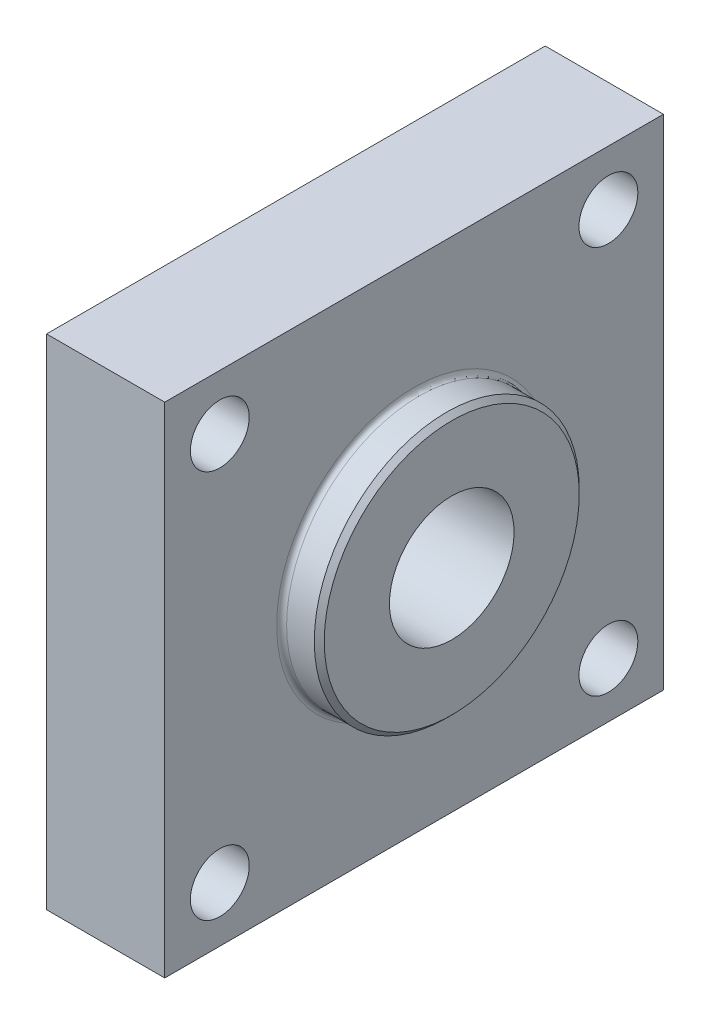
ISO-10303-21;
HEADER;
FILE_DESCRIPTION(('STEP AP214'),'2;1');
FILE_NAME('part.step','',(''),(''),'','','');
FILE_SCHEMA(('AUTOMOTIVE_DESIGN { 1 0 10303 214 1 1 1 1 }'));
ENDSEC;
DATA;
#1=APPLICATION_CONTEXT('core data for automotive mechanical design processes');
#2=APPLICATION_PROTOCOL_DEFINITION('international standard','automotive_design',2000,#1);
#3=PRODUCT_CONTEXT('',#1,'mechanical');
#4=PRODUCT('Part','Part','',(#3));
#5=PRODUCT_RELATED_PRODUCT_CATEGORY('part','',(#4));
#6=PRODUCT_DEFINITION_FORMATION('','',#4);
#7=PRODUCT_DEFINITION_CONTEXT('part definition',#1,'design');
#8=PRODUCT_DEFINITION('design','',#6,#7);
#9=PRODUCT_DEFINITION_SHAPE('','',#8);
#10=(LENGTH_UNIT() NAMED_UNIT(*) SI_UNIT(.MILLI.,.METRE.));
#11=(NAMED_UNIT(*) PLANE_ANGLE_UNIT() SI_UNIT($,.RADIAN.));
#12=(NAMED_UNIT(*) SI_UNIT($,.STERADIAN.) SOLID_ANGLE_UNIT());
#13=UNCERTAINTY_MEASURE_WITH_UNIT(LENGTH_MEASURE(1.E-05),#10,'distance_accuracy_value','');
#14=(GEOMETRIC_REPRESENTATION_CONTEXT(3) GLOBAL_UNCERTAINTY_ASSIGNED_CONTEXT((#13)) GLOBAL_UNIT_ASSIGNED_CONTEXT((#10,
#11,#12)) REPRESENTATION_CONTEXT('',''));
#15=CARTESIAN_POINT('',(0.,0.,0.));
#16=DIRECTION('',(0.,0.,1.));
#17=DIRECTION('',(1.,0.,0.));
#18=AXIS2_PLACEMENT_3D('',#15,#16,#17);
#19=CARTESIAN_POINT('',(3.96875,12.7,12.7));
#20=DIRECTION('',(0.,0.,-1.));
#21=DIRECTION('',(-1.,0.,0.));
#22=AXIS2_PLACEMENT_3D('',#19,#20,#21);
#23=PLANE('',#22);
#24=DIRECTION('',(0.,-1.,0.));
#25=VECTOR('',#24,1.);
#26=CARTESIAN_POINT('',(2.05105,12.7,12.7));
#27=LINE('',#26,#25);
#28=CARTESIAN_POINT('',(2.05105,12.7,12.7));
#29=VERTEX_POINT('',#28);
#30=CARTESIAN_POINT('',(2.05105,-12.7,12.7));
#31=VERTEX_POINT('',#30);
#32=EDGE_CURVE('E61',#29,#31,#27,.T.);
#33=ORIENTED_EDGE('',*,*,#32,.F.);
#34=DIRECTION('',(-1.,0.,0.));
#35=VECTOR('',#34,1.);
#36=CARTESIAN_POINT('',(3.96875,12.7,12.7));
#37=LINE('',#36,#35);
#38=CARTESIAN_POINT('',(-3.96875,12.7,12.7));
#39=VERTEX_POINT('',#38);
#40=EDGE_CURVE('E42',#29,#39,#37,.T.);
#41=ORIENTED_EDGE('',*,*,#40,.T.);
#42=DIRECTION('',(0.,-1.,0.));
#43=VECTOR('',#42,1.);
#44=CARTESIAN_POINT('',(-3.96875,12.7,12.7));
#45=LINE('',#44,#43);
#46=CARTESIAN_POINT('',(-3.96875,-12.7,12.7));
#47=VERTEX_POINT('',#46);
#48=EDGE_CURVE('E69',#39,#47,#45,.T.);
#49=ORIENTED_EDGE('',*,*,#48,.T.);
#50=DIRECTION('',(-1.,0.,0.));
#51=VECTOR('',#50,1.);
#52=CARTESIAN_POINT('',(3.96875,-12.7,12.7));
#53=LINE('',#52,#51);
#54=EDGE_CURVE('E66',#31,#47,#53,.T.);
#55=ORIENTED_EDGE('',*,*,#54,.F.);
#56=EDGE_LOOP('',(#33,#41,#49,#55));
#57=FACE_BOUND('',#56,.T.);
#58=ADVANCED_FACE('F18',(#57),#23,.F.);
#59=CARTESIAN_POINT('',(3.96875,-12.7,12.7));
#60=DIRECTION('',(0.,1.,0.));
#61=DIRECTION('',(0.,0.,1.));
#62=AXIS2_PLACEMENT_3D('',#59,#60,#61);
#63=PLANE('',#62);
#64=DIRECTION('',(0.,0.,-1.));
#65=VECTOR('',#64,1.);
#66=CARTESIAN_POINT('',(2.05105,-12.7,12.7));
#67=LINE('',#66,#65);
#68=CARTESIAN_POINT('',(2.05105,-12.7,-12.7));
#69=VERTEX_POINT('',#68);
#70=EDGE_CURVE('E70',#31,#69,#67,.T.);
#71=ORIENTED_EDGE('',*,*,#70,.F.);
#72=ORIENTED_EDGE('',*,*,#54,.T.);
#73=DIRECTION('',(0.,0.,-1.));
#74=VECTOR('',#73,1.);
#75=CARTESIAN_POINT('',(-3.96875,-12.7,12.7));
#76=LINE('',#75,#74);
#77=CARTESIAN_POINT('',(-3.96875,-12.7,-12.7));
#78=VERTEX_POINT('',#77);
#79=EDGE_CURVE('E177',#47,#78,#76,.T.);
#80=ORIENTED_EDGE('',*,*,#79,.T.);
#81=DIRECTION('',(-1.,0.,0.));
#82=VECTOR('',#81,1.);
#83=CARTESIAN_POINT('',(3.96875,-12.7,-12.7));
#84=LINE('',#83,#82);
#85=EDGE_CURVE('E78',#69,#78,#84,.T.);
#86=ORIENTED_EDGE('',*,*,#85,.F.);
#87=EDGE_LOOP('',(#71,#72,#80,#86));
#88=FACE_BOUND('',#87,.T.);
#89=ADVANCED_FACE('F125',(#88),#63,.F.);
#90=CARTESIAN_POINT('',(3.96875,12.7,-12.7));
#91=DIRECTION('',(0.,0.,1.));
#92=DIRECTION('',(0.,-1.,0.));
#93=AXIS2_PLACEMENT_3D('',#90,#91,#92);
#94=PLANE('',#93);
#95=DIRECTION('',(0.,1.,0.));
#96=VECTOR('',#95,1.);
#97=CARTESIAN_POINT('',(2.05105,12.7,-12.7));
#98=LINE('',#97,#96);
#99=CARTESIAN_POINT('',(2.05105,12.7,-12.7));
#100=VERTEX_POINT('',#99);
#101=EDGE_CURVE('E34',#69,#100,#98,.T.);
#102=ORIENTED_EDGE('',*,*,#101,.F.);
#103=ORIENTED_EDGE('',*,*,#85,.T.);
#104=DIRECTION('',(0.,1.,0.));
#105=VECTOR('',#104,1.);
#106=CARTESIAN_POINT('',(-3.96875,12.7,-12.7));
#107=LINE('',#106,#105);
#108=CARTESIAN_POINT('',(-3.96875,12.7,-12.7));
#109=VERTEX_POINT('',#108);
#110=EDGE_CURVE('E80',#78,#109,#107,.T.);
#111=ORIENTED_EDGE('',*,*,#110,.T.);
#112=DIRECTION('',(-1.,0.,0.));
#113=VECTOR('',#112,1.);
#114=CARTESIAN_POINT('',(3.96875,12.7,-12.7));
#115=LINE('',#114,#113);
#116=EDGE_CURVE('E76',#100,#109,#115,.T.);
#117=ORIENTED_EDGE('',*,*,#116,.F.);
#118=EDGE_LOOP('',(#102,#103,#111,#117));
#119=FACE_BOUND('',#118,.T.);
#120=ADVANCED_FACE('F130',(#119),#94,.F.);
#121=CARTESIAN_POINT('',(3.96875,12.7,12.7));
#122=DIRECTION('',(0.,-1.,0.));
#123=DIRECTION('',(0.,0.,-1.));
#124=AXIS2_PLACEMENT_3D('',#121,#122,#123);
#125=PLANE('',#124);
#126=DIRECTION('',(0.,0.,1.));
#127=VECTOR('',#126,1.);
#128=CARTESIAN_POINT('',(2.05105,12.7,12.7));
#129=LINE('',#128,#127);
#130=EDGE_CURVE('E59',#100,#29,#129,.T.);
#131=ORIENTED_EDGE('',*,*,#130,.F.);
#132=ORIENTED_EDGE('',*,*,#116,.T.);
#133=DIRECTION('',(0.,0.,1.));
#134=VECTOR('',#133,1.);
#135=CARTESIAN_POINT('',(-3.96875,12.7,12.7));
#136=LINE('',#135,#134);
#137=EDGE_CURVE('E74',#109,#39,#136,.T.);
#138=ORIENTED_EDGE('',*,*,#137,.T.);
#139=ORIENTED_EDGE('',*,*,#40,.F.);
#140=EDGE_LOOP('',(#131,#132,#138,#139));
#141=FACE_BOUND('',#140,.T.);
#142=ADVANCED_FACE('F72',(#141),#125,.F.);
#143=CARTESIAN_POINT('',(-3.96875,-12.7,12.7));
#144=DIRECTION('',(1.,0.,0.));
#145=DIRECTION('',(0.,0.,-1.));
#146=AXIS2_PLACEMENT_3D('',#143,#144,#145);
#147=PLANE('',#146);
#148=CARTESIAN_POINT('',(-3.96875,-9.89624224541833,-9.89624224541809));
#149=DIRECTION('',(1.,0.,0.));
#150=DIRECTION('',(0.,0.,-1.));
#151=AXIS2_PLACEMENT_3D('',#148,#149,#150);
#152=CIRCLE('',#151,1.5);
#153=CARTESIAN_POINT('',(-3.96875,-9.89624224541833,-11.3962422454181));
#154=VERTEX_POINT('',#153);
#155=EDGE_CURVE('E208',#154,#154,#152,.T.);
#156=ORIENTED_EDGE('',*,*,#155,.T.);
#157=EDGE_LOOP('',(#156));
#158=FACE_BOUND('',#157,.T.);
#159=CARTESIAN_POINT('',(-3.96875,9.89624224541812,-9.89624224541829));
#160=DIRECTION('',(1.,0.,0.));
#161=DIRECTION('',(0.,0.,-1.));
#162=AXIS2_PLACEMENT_3D('',#159,#160,#161);
#163=CIRCLE('',#162,1.5);
#164=CARTESIAN_POINT('',(-3.96875,9.89624224541812,-11.3962422454183));
#165=VERTEX_POINT('',#164);
#166=EDGE_CURVE('E202',#165,#165,#163,.T.);
#167=ORIENTED_EDGE('',*,*,#166,.T.);
#168=EDGE_LOOP('',(#167));
#169=FACE_BOUND('',#168,.T.);
#170=CARTESIAN_POINT('',(-3.96875,9.89624224541826,9.89624224541816));
#171=DIRECTION('',(1.,0.,0.));
#172=DIRECTION('',(0.,0.,-1.));
#173=AXIS2_PLACEMENT_3D('',#170,#171,#172);
#174=CIRCLE('',#173,1.5);
#175=CARTESIAN_POINT('',(-3.96875,9.89624224541826,8.39624224541816));
#176=VERTEX_POINT('',#175);
#177=EDGE_CURVE('E196',#176,#176,#174,.T.);
#178=ORIENTED_EDGE('',*,*,#177,.T.);
#179=EDGE_LOOP('',(#178));
#180=FACE_BOUND('',#179,.T.);
#181=CARTESIAN_POINT('',(-3.96875,-9.89624224541819,9.89624224541822));
#182=DIRECTION('',(1.,0.,0.));
#183=DIRECTION('',(0.,0.,-1.));
#184=AXIS2_PLACEMENT_3D('',#181,#182,#183);
#185=CIRCLE('',#184,1.5);
#186=CARTESIAN_POINT('',(-3.96875,-9.89624224541819,8.39624224541823));
#187=VERTEX_POINT('',#186);
#188=EDGE_CURVE('E190',#187,#187,#185,.T.);
#189=ORIENTED_EDGE('',*,*,#188,.T.);
#190=EDGE_LOOP('',(#189));
#191=FACE_BOUND('',#190,.T.);
#192=CARTESIAN_POINT('',(-3.96875,0.,0.));
#193=DIRECTION('',(1.,0.,0.));
#194=DIRECTION('',(0.,0.,-1.));
#195=AXIS2_PLACEMENT_3D('',#192,#193,#194);
#196=CIRCLE('',#195,10.2616);
#197=CARTESIAN_POINT('',(-3.96875,0.,-10.2616));
#198=VERTEX_POINT('',#197);
#199=EDGE_CURVE('E12',#198,#198,#196,.T.);
#200=ORIENTED_EDGE('',*,*,#199,.T.);
#201=EDGE_LOOP('',(#200));
#202=FACE_BOUND('',#201,.T.);
#203=ORIENTED_EDGE('',*,*,#48,.F.);
#204=ORIENTED_EDGE('',*,*,#137,.F.);
#205=ORIENTED_EDGE('',*,*,#110,.F.);
#206=ORIENTED_EDGE('',*,*,#79,.F.);
#207=EDGE_LOOP('',(#203,#204,#205,#206));
#208=FACE_BOUND('',#207,.T.);
#209=ADVANCED_FACE('F163',(#158,#169,#180,#191,#202,#208),#147,.F.);
#210=CARTESIAN_POINT('',(2.05105,-12.7,12.7));
#211=DIRECTION('',(1.,0.,0.));
#212=DIRECTION('',(0.,0.,-1.));
#213=AXIS2_PLACEMENT_3D('',#210,#211,#212);
#214=PLANE('',#213);
#215=CARTESIAN_POINT('',(2.05105,-9.89624224541833,-9.89624224541809));
#216=DIRECTION('',(1.,0.,0.));
#217=DIRECTION('',(0.,0.,-1.));
#218=AXIS2_PLACEMENT_3D('',#215,#216,#217);
#219=CIRCLE('',#218,1.5);
#220=CARTESIAN_POINT('',(2.05105,-9.89624224541833,-11.3962422454181));
#221=VERTEX_POINT('',#220);
#222=EDGE_CURVE('E205',#221,#221,#219,.T.);
#223=ORIENTED_EDGE('',*,*,#222,.F.);
#224=EDGE_LOOP('',(#223));
#225=FACE_BOUND('',#224,.T.);
#226=CARTESIAN_POINT('',(2.05105,9.89624224541812,-9.89624224541829));
#227=DIRECTION('',(1.,0.,0.));
#228=DIRECTION('',(0.,0.,-1.));
#229=AXIS2_PLACEMENT_3D('',#226,#227,#228);
#230=CIRCLE('',#229,1.5);
#231=CARTESIAN_POINT('',(2.05105,9.89624224541812,-11.3962422454183));
#232=VERTEX_POINT('',#231);
#233=EDGE_CURVE('E199',#232,#232,#230,.T.);
#234=ORIENTED_EDGE('',*,*,#233,.F.);
#235=EDGE_LOOP('',(#234));
#236=FACE_BOUND('',#235,.T.);
#237=CARTESIAN_POINT('',(2.05105,9.89624224541826,9.89624224541816));
#238=DIRECTION('',(1.,0.,0.));
#239=DIRECTION('',(0.,0.,-1.));
#240=AXIS2_PLACEMENT_3D('',#237,#238,#239);
#241=CIRCLE('',#240,1.5);
#242=CARTESIAN_POINT('',(2.05105,9.89624224541826,8.39624224541816));
#243=VERTEX_POINT('',#242);
#244=EDGE_CURVE('E193',#243,#243,#241,.T.);
#245=ORIENTED_EDGE('',*,*,#244,.F.);
#246=EDGE_LOOP('',(#245));
#247=FACE_BOUND('',#246,.T.);
#248=CARTESIAN_POINT('',(2.05105,-9.89624224541819,9.89624224541822));
#249=DIRECTION('',(1.,0.,0.));
#250=DIRECTION('',(0.,0.,-1.));
#251=AXIS2_PLACEMENT_3D('',#248,#249,#250);
#252=CIRCLE('',#251,1.5);
#253=CARTESIAN_POINT('',(2.05105,-9.89624224541819,8.39624224541822));
#254=VERTEX_POINT('',#253);
#255=EDGE_CURVE('E187',#254,#254,#252,.T.);
#256=ORIENTED_EDGE('',*,*,#255,.F.);
#257=EDGE_LOOP('',(#256));
#258=FACE_BOUND('',#257,.T.);
#259=CARTESIAN_POINT('',(2.05105,0.,0.));
#260=DIRECTION('',(1.,0.,0.));
#261=DIRECTION('',(0.,0.,-1.));
#262=AXIS2_PLACEMENT_3D('',#259,#260,#261);
#263=CIRCLE('',#262,7.000875);
#264=CARTESIAN_POINT('',(2.05105,0.,-7.000875));
#265=VERTEX_POINT('',#264);
#266=EDGE_CURVE('E65',#265,#265,#263,.F.);
#267=ORIENTED_EDGE('',*,*,#266,.T.);
#268=EDGE_LOOP('',(#267));
#269=FACE_BOUND('',#268,.T.);
#270=ORIENTED_EDGE('',*,*,#32,.T.);
#271=ORIENTED_EDGE('',*,*,#70,.T.);
#272=ORIENTED_EDGE('',*,*,#101,.T.);
#273=ORIENTED_EDGE('',*,*,#130,.T.);
#274=EDGE_LOOP('',(#270,#271,#272,#273));
#275=FACE_BOUND('',#274,.T.);
#276=ADVANCED_FACE('F60',(#225,#236,#247,#258,#269,#275),#214,.T.);
#277=CARTESIAN_POINT('',(-40.2489847291194,0.,0.));
#278=DIRECTION('',(1.,0.,0.));
#279=DIRECTION('',(0.,0.,-1.));
#280=AXIS2_PLACEMENT_3D('',#277,#278,#279);
#281=CYLINDRICAL_SURFACE('',#280,6.746875);
#282=CARTESIAN_POINT('',(3.71474999999999,0.,0.));
#283=DIRECTION('',(1.,0.,0.));
#284=DIRECTION('',(0.,0.,-1.));
#285=AXIS2_PLACEMENT_3D('',#282,#283,#284);
#286=CIRCLE('',#285,6.746875);
#287=CARTESIAN_POINT('',(3.71474999999998,0.,-6.746875));
#288=VERTEX_POINT('',#287);
#289=EDGE_CURVE('E94',#288,#288,#286,.F.);
#290=CARTESIAN_POINT('',(2.30505,0.,0.));
#291=DIRECTION('',(1.,0.,0.));
#292=DIRECTION('',(0.,0.,-1.));
#293=AXIS2_PLACEMENT_3D('',#290,#291,#292);
#294=CIRCLE('',#293,6.746875);
#295=CARTESIAN_POINT('',(2.30505,0.,-6.746875));
#296=VERTEX_POINT('',#295);
#297=EDGE_CURVE('E88',#296,#296,#294,.T.);
#298=CARTESIAN_POINT('',(3.71474999999998,0.,-6.746875));
#299=CARTESIAN_POINT('',(3.70006562499998,0.,-6.746875));
#300=CARTESIAN_POINT('',(3.68538124999998,0.,-6.746875));
#301=CARTESIAN_POINT('',(3.65601249999998,0.,-6.746875));
#302=CARTESIAN_POINT('',(3.64132812499998,0.,-6.746875));
#303=CARTESIAN_POINT('',(3.61195937499998,0.,-6.746875));
#304=CARTESIAN_POINT('',(3.59727499999999,0.,-6.746875));
#305=CARTESIAN_POINT('',(3.56790624999999,0.,-6.746875));
#306=CARTESIAN_POINT('',(3.55322187499999,0.,-6.746875));
#307=CARTESIAN_POINT('',(3.52385312499999,0.,-6.746875));
#308=CARTESIAN_POINT('',(3.50916874999998,0.,-6.746875));
#309=CARTESIAN_POINT('',(3.47979999999998,0.,-6.746875));
#310=CARTESIAN_POINT('',(3.46511562499998,0.,-6.746875));
#311=CARTESIAN_POINT('',(3.43574687499998,0.,-6.746875));
#312=CARTESIAN_POINT('',(3.42106249999998,0.,-6.746875));
#313=CARTESIAN_POINT('',(3.39169374999998,0.,-6.746875));
#314=CARTESIAN_POINT('',(3.37700937499998,0.,-6.746875));
#315=CARTESIAN_POINT('',(3.34764062499999,0.,-6.746875));
#316=CARTESIAN_POINT('',(3.33295624999999,0.,-6.746875));
#317=CARTESIAN_POINT('',(3.30358749999999,0.,-6.746875));
#318=CARTESIAN_POINT('',(3.28890312499999,0.,-6.746875));
#319=CARTESIAN_POINT('',(3.25953437499999,0.,-6.746875));
#320=CARTESIAN_POINT('',(3.24484999999999,0.,-6.746875));
#321=CARTESIAN_POINT('',(3.21548124999999,0.,-6.746875));
#322=CARTESIAN_POINT('',(3.20079687499999,0.,-6.746875));
#323=CARTESIAN_POINT('',(3.17142812499998,0.,-6.746875));
#324=CARTESIAN_POINT('',(3.15674374999998,0.,-6.746875));
#325=CARTESIAN_POINT('',(3.12737499999999,0.,-6.746875));
#326=CARTESIAN_POINT('',(3.11269062499999,0.,-6.746875));
#327=CARTESIAN_POINT('',(3.08332187499999,0.,-6.746875));
#328=CARTESIAN_POINT('',(3.06863749999999,0.,-6.746875));
#329=CARTESIAN_POINT('',(3.03926874999999,0.,-6.746875));
#330=CARTESIAN_POINT('',(3.02458437499999,0.,-6.746875));
#331=CARTESIAN_POINT('',(2.99521562499999,0.,-6.746875));
#332=CARTESIAN_POINT('',(2.98053124999999,0.,-6.746875));
#333=CARTESIAN_POINT('',(2.95116249999999,0.,-6.746875));
#334=CARTESIAN_POINT('',(2.93647812499999,0.,-6.746875));
#335=CARTESIAN_POINT('',(2.90710937499999,0.,-6.746875));
#336=CARTESIAN_POINT('',(2.89242499999999,0.,-6.746875));
#337=CARTESIAN_POINT('',(2.86305624999999,0.,-6.746875));
#338=CARTESIAN_POINT('',(2.84837187499999,0.,-6.746875));
#339=CARTESIAN_POINT('',(2.81900312499999,0.,-6.746875));
#340=CARTESIAN_POINT('',(2.80431874999999,0.,-6.746875));
#341=CARTESIAN_POINT('',(2.77494999999999,0.,-6.746875));
#342=CARTESIAN_POINT('',(2.76026562499999,0.,-6.746875));
#343=CARTESIAN_POINT('',(2.73089687499999,0.,-6.746875));
#344=CARTESIAN_POINT('',(2.71621249999999,0.,-6.746875));
#345=CARTESIAN_POINT('',(2.68684374999999,0.,-6.746875));
#346=CARTESIAN_POINT('',(2.67215937499999,0.,-6.746875));
#347=CARTESIAN_POINT('',(2.64279062499999,0.,-6.746875));
#348=CARTESIAN_POINT('',(2.62810624999999,0.,-6.746875));
#349=CARTESIAN_POINT('',(2.59873749999999,0.,-6.746875));
#350=CARTESIAN_POINT('',(2.58405312499999,0.,-6.746875));
#351=CARTESIAN_POINT('',(2.554684375,0.,-6.746875));
#352=CARTESIAN_POINT('',(2.54,0.,-6.746875));
#353=CARTESIAN_POINT('',(2.51063124999999,0.,-6.746875));
#354=CARTESIAN_POINT('',(2.49594687499999,0.,-6.746875));
#355=CARTESIAN_POINT('',(2.46657812499999,0.,-6.746875));
#356=CARTESIAN_POINT('',(2.45189374999999,0.,-6.746875));
#357=CARTESIAN_POINT('',(2.42252499999999,0.,-6.746875));
#358=CARTESIAN_POINT('',(2.40784062499999,0.,-6.746875));
#359=CARTESIAN_POINT('',(2.37847187499999,0.,-6.746875));
#360=CARTESIAN_POINT('',(2.36378749999999,0.,-6.746875));
#361=CARTESIAN_POINT('',(2.33441875,0.,-6.746875));
#362=CARTESIAN_POINT('',(2.319734375,0.,-6.746875));
#363=CARTESIAN_POINT('',(2.30505,0.,-6.746875));
#364=B_SPLINE_CURVE_WITH_KNOTS('',3,(#298,#299,#300,#301,#302,#303,#304,#305,#306,#307,#308,
#309,#310,#311,#312,#313,#314,#315,#316,#317,#318,#319,#320,#321,#322,#323,#324,#325,#326,#327,
#328,#329,#330,#331,#332,#333,#334,#335,#336,#337,#338,#339,#340,#341,#342,#343,#344,#345,#346,
#347,#348,#349,#350,#351,#352,#353,#354,#355,#356,#357,#358,#359,#360,#361,#362,#363),
.UNSPECIFIED.,.F.,.F.,(4,2,2,2,2,2,2,2,2,2,2,2,2,2,2,2,2,2,2,2,2,2,2,2,2,2,2,2,2,2,2,2,4),(0.,
0.0440531249999987,0.0881062499999974,0.132159374999996,0.176212499999995,0.220265625,
0.264318749999999,0.308371874999998,0.352424999999996,0.396478124999995,0.440531249999994,
0.484584374999993,0.528637499999998,0.572690624999997,0.616743749999996,0.660796874999994,
0.704849999999993,0.748903124999992,0.79295624999999,0.837009374999989,0.881062499999988,
0.925115624999993,0.969168749999992,1.01322187499999,1.05727499999999,1.10132812499999,
1.14538124999999,1.18943437499999,1.23348749999999,1.27754062499999,1.32159374999999,
1.36564687499999,1.40969999999999),.UNSPECIFIED.);
#365=EDGE_CURVE('BSEAM152',#288,#296,#364,.T.);
#366=ORIENTED_EDGE('',*,*,#289,.T.);
#367=ORIENTED_EDGE('',*,*,#297,.T.);
#368=ORIENTED_EDGE('',*,*,#365,.T.);
#369=ORIENTED_EDGE('',*,*,#365,.F.);
#370=EDGE_LOOP('',(#366,#368,#367,#369));
#371=FACE_BOUND('',#370,.T.);
#372=ADVANCED_FACE('F152',(#371),#281,.T.);
#373=CARTESIAN_POINT('',(3.96875,-12.7,12.7));
#374=DIRECTION('',(1.,0.,0.));
#375=DIRECTION('',(0.,0.,-1.));
#376=AXIS2_PLACEMENT_3D('',#373,#374,#375);
#377=PLANE('',#376);
#378=CARTESIAN_POINT('',(3.96875,0.,0.));
#379=DIRECTION('',(1.,0.,0.));
#380=DIRECTION('',(0.,0.,-1.));
#381=AXIS2_PLACEMENT_3D('',#378,#379,#380);
#382=CIRCLE('',#381,3.175);
#383=CARTESIAN_POINT('',(3.96875,0.,-3.175));
#384=VERTEX_POINT('',#383);
#385=EDGE_CURVE('E184',#384,#384,#382,.T.);
#386=ORIENTED_EDGE('',*,*,#385,.F.);
#387=EDGE_LOOP('',(#386));
#388=FACE_BOUND('',#387,.T.);
#389=CARTESIAN_POINT('',(3.96875,0.,0.));
#390=DIRECTION('',(1.,0.,0.));
#391=DIRECTION('',(0.,0.,-1.));
#392=AXIS2_PLACEMENT_3D('',#389,#390,#391);
#393=CIRCLE('',#392,6.49287499999999);
#394=CARTESIAN_POINT('',(3.96875,0.,-6.49287499999999));
#395=VERTEX_POINT('',#394);
#396=EDGE_CURVE('E91',#395,#395,#393,.T.);
#397=ORIENTED_EDGE('',*,*,#396,.T.);
#398=EDGE_LOOP('',(#397));
#399=FACE_BOUND('',#398,.T.);
#400=ADVANCED_FACE('F139',(#388,#399),#377,.T.);
#401=CARTESIAN_POINT('',(2.30505,0.,0.));
#402=DIRECTION('',(1.,0.,0.));
#403=DIRECTION('',(0.,0.,-1.));
#404=AXIS2_PLACEMENT_3D('',#401,#402,#403);
#405=TOROIDAL_SURFACE('',#404,7.000875,0.254);
#406=ORIENTED_EDGE('',*,*,#297,.F.);
#407=EDGE_LOOP('',(#406));
#408=FACE_BOUND('',#407,.T.);
#409=ORIENTED_EDGE('',*,*,#266,.F.);
#410=EDGE_LOOP('',(#409));
#411=FACE_BOUND('',#410,.T.);
#412=ADVANCED_FACE('F135',(#408,#411),#405,.F.);
#413=CARTESIAN_POINT('',(3.96875,0.,0.));
#414=DIRECTION('',(-1.,0.,0.));
#415=DIRECTION('',(0.,0.,1.));
#416=AXIS2_PLACEMENT_3D('',#413,#414,#415);
#417=CONICAL_SURFACE('',#416,6.49287499999999,0.785398163397452);
#418=ORIENTED_EDGE('',*,*,#289,.F.);
#419=EDGE_LOOP('',(#418));
#420=FACE_BOUND('',#419,.T.);
#421=ORIENTED_EDGE('',*,*,#396,.F.);
#422=EDGE_LOOP('',(#421));
#423=FACE_BOUND('',#422,.T.);
#424=ADVANCED_FACE('F138',(#420,#423),#417,.T.);
#425=CARTESIAN_POINT('',(-1.80975,0.,0.));
#426=DIRECTION('',(-1.,0.,0.));
#427=DIRECTION('',(0.,0.,1.));
#428=AXIS2_PLACEMENT_3D('',#425,#426,#427);
#429=CYLINDRICAL_SURFACE('',#428,10.0076);
#430=CARTESIAN_POINT('',(-3.71475,0.,0.));
#431=DIRECTION('',(1.,0.,0.));
#432=DIRECTION('',(0.,0.,-1.));
#433=AXIS2_PLACEMENT_3D('',#430,#431,#432);
#434=CIRCLE('',#433,10.0076);
#435=CARTESIAN_POINT('',(-3.71475,0.,-10.0076));
#436=VERTEX_POINT('',#435);
#437=EDGE_CURVE('E27',#436,#436,#434,.F.);
#438=ORIENTED_EDGE('',*,*,#437,.T.);
#439=EDGE_LOOP('',(#438));
#440=FACE_BOUND('',#439,.T.);
#441=CARTESIAN_POINT('',(-2.19075,0.,0.));
#442=DIRECTION('',(-1.,0.,0.));
#443=DIRECTION('',(0.,0.,1.));
#444=AXIS2_PLACEMENT_3D('',#441,#442,#443);
#445=CIRCLE('',#444,10.0076);
#446=CARTESIAN_POINT('',(-2.19075,0.,10.0076));
#447=VERTEX_POINT('',#446);
#448=EDGE_CURVE('E100',#447,#447,#445,.F.);
#449=ORIENTED_EDGE('',*,*,#448,.T.);
#450=EDGE_LOOP('',(#449));
#451=FACE_BOUND('',#450,.T.);
#452=ADVANCED_FACE('F106',(#440,#451),#429,.F.);
#453=CARTESIAN_POINT('',(-1.80975,0.,0.));
#454=DIRECTION('',(-1.,0.,0.));
#455=DIRECTION('',(0.,0.,1.));
#456=AXIS2_PLACEMENT_3D('',#453,#454,#455);
#457=PLANE('',#456);
#458=CARTESIAN_POINT('',(-1.80975,0.,0.));
#459=DIRECTION('',(-1.,0.,0.));
#460=DIRECTION('',(0.,0.,1.));
#461=AXIS2_PLACEMENT_3D('',#458,#459,#460);
#462=CIRCLE('',#461,3.175);
#463=CARTESIAN_POINT('',(-1.80975,0.,3.175));
#464=VERTEX_POINT('',#463);
#465=EDGE_CURVE('E22',#464,#464,#462,.F.);
#466=ORIENTED_EDGE('',*,*,#465,.T.);
#467=EDGE_LOOP('',(#466));
#468=FACE_BOUND('',#467,.T.);
#469=CARTESIAN_POINT('',(-1.80975,0.,0.));
#470=DIRECTION('',(-1.,0.,0.));
#471=DIRECTION('',(0.,0.,1.));
#472=AXIS2_PLACEMENT_3D('',#469,#470,#471);
#473=CIRCLE('',#472,9.6266);
#474=CARTESIAN_POINT('',(-1.80975,0.,9.6266));
#475=VERTEX_POINT('',#474);
#476=EDGE_CURVE('E97',#475,#475,#473,.T.);
#477=ORIENTED_EDGE('',*,*,#476,.T.);
#478=EDGE_LOOP('',(#477));
#479=FACE_BOUND('',#478,.T.);
#480=ADVANCED_FACE('F121',(#468,#479),#457,.T.);
#481=CARTESIAN_POINT('',(-2.19075,0.,0.));
#482=DIRECTION('',(-1.,0.,0.));
#483=DIRECTION('',(0.,0.,1.));
#484=AXIS2_PLACEMENT_3D('',#481,#482,#483);
#485=TOROIDAL_SURFACE('',#484,9.6266,0.381);
#486=ORIENTED_EDGE('',*,*,#448,.F.);
#487=EDGE_LOOP('',(#486));
#488=FACE_BOUND('',#487,.T.);
#489=ORIENTED_EDGE('',*,*,#476,.F.);
#490=EDGE_LOOP('',(#489));
#491=FACE_BOUND('',#490,.T.);
#492=ADVANCED_FACE('F111',(#488,#491),#485,.F.);
#493=CARTESIAN_POINT('',(-3.71475,0.,0.));
#494=DIRECTION('',(-1.,0.,0.));
#495=DIRECTION('',(0.,0.,1.));
#496=AXIS2_PLACEMENT_3D('',#493,#494,#495);
#497=CONICAL_SURFACE('',#496,10.0076,0.78539816339745);
#498=ORIENTED_EDGE('',*,*,#199,.F.);
#499=EDGE_LOOP('',(#498));
#500=FACE_BOUND('',#499,.T.);
#501=ORIENTED_EDGE('',*,*,#437,.F.);
#502=EDGE_LOOP('',(#501));
#503=FACE_BOUND('',#502,.T.);
#504=ADVANCED_FACE('F20',(#500,#503),#497,.F.);
#505=CARTESIAN_POINT('',(3.96875,0.,0.));
#506=DIRECTION('',(-1.,0.,0.));
#507=DIRECTION('',(0.,0.,1.));
#508=AXIS2_PLACEMENT_3D('',#505,#506,#507);
#509=CYLINDRICAL_SURFACE('',#508,3.175);
#510=ORIENTED_EDGE('',*,*,#465,.F.);
#511=EDGE_LOOP('',(#510));
#512=FACE_BOUND('',#511,.T.);
#513=ORIENTED_EDGE('',*,*,#385,.T.);
#514=EDGE_LOOP('',(#513));
#515=FACE_BOUND('',#514,.T.);
#516=ADVANCED_FACE('F110',(#512,#515),#509,.F.);
#517=CARTESIAN_POINT('',(2.05105,-9.89624224541819,9.89624224541822));
#518=DIRECTION('',(1.,0.,0.));
#519=DIRECTION('',(0.,0.,-1.));
#520=AXIS2_PLACEMENT_3D('',#517,#518,#519);
#521=CYLINDRICAL_SURFACE('',#520,1.5);
#522=ORIENTED_EDGE('',*,*,#188,.F.);
#523=EDGE_LOOP('',(#522));
#524=FACE_BOUND('',#523,.T.);
#525=ORIENTED_EDGE('',*,*,#255,.T.);
#526=EDGE_LOOP('',(#525));
#527=FACE_BOUND('',#526,.T.);
#528=ADVANCED_FACE('F118',(#524,#527),#521,.F.);
#529=CARTESIAN_POINT('',(2.05105,9.89624224541826,9.89624224541816));
#530=DIRECTION('',(1.,0.,0.));
#531=DIRECTION('',(0.,0.,-1.));
#532=AXIS2_PLACEMENT_3D('',#529,#530,#531);
#533=CYLINDRICAL_SURFACE('',#532,1.5);
#534=ORIENTED_EDGE('',*,*,#177,.F.);
#535=EDGE_LOOP('',(#534));
#536=FACE_BOUND('',#535,.T.);
#537=ORIENTED_EDGE('',*,*,#244,.T.);
#538=EDGE_LOOP('',(#537));
#539=FACE_BOUND('',#538,.T.);
#540=ADVANCED_FACE('F232',(#536,#539),#533,.F.);
#541=CARTESIAN_POINT('',(2.05105,9.89624224541812,-9.89624224541829));
#542=DIRECTION('',(1.,0.,0.));
#543=DIRECTION('',(0.,0.,-1.));
#544=AXIS2_PLACEMENT_3D('',#541,#542,#543);
#545=CYLINDRICAL_SURFACE('',#544,1.5);
#546=ORIENTED_EDGE('',*,*,#166,.F.);
#547=EDGE_LOOP('',(#546));
#548=FACE_BOUND('',#547,.T.);
#549=ORIENTED_EDGE('',*,*,#233,.T.);
#550=EDGE_LOOP('',(#549));
#551=FACE_BOUND('',#550,.T.);
#552=ADVANCED_FACE('F216',(#548,#551),#545,.F.);
#553=CARTESIAN_POINT('',(2.05105,-9.89624224541833,-9.89624224541809));
#554=DIRECTION('',(1.,0.,0.));
#555=DIRECTION('',(0.,0.,-1.));
#556=AXIS2_PLACEMENT_3D('',#553,#554,#555);
#557=CYLINDRICAL_SURFACE('',#556,1.5);
#558=ORIENTED_EDGE('',*,*,#155,.F.);
#559=EDGE_LOOP('',(#558));
#560=FACE_BOUND('',#559,.T.);
#561=ORIENTED_EDGE('',*,*,#222,.T.);
#562=EDGE_LOOP('',(#561));
#563=FACE_BOUND('',#562,.T.);
#564=ADVANCED_FACE('F213',(#560,#563),#557,.F.);
#565=CLOSED_SHELL('',(#58,#89,#120,#142,#209,#276,#372,#400,#412,#424,#452,#480,#492,#504,#516,
#528,#540,#552,#564));
#566=MANIFOLD_SOLID_BREP('B1',#565);
#567=ADVANCED_BREP_SHAPE_REPRESENTATION('',(#18,#566),#14);
#568=SHAPE_DEFINITION_REPRESENTATION(#9,#567);
ENDSEC;
END-ISO-10303-21;
